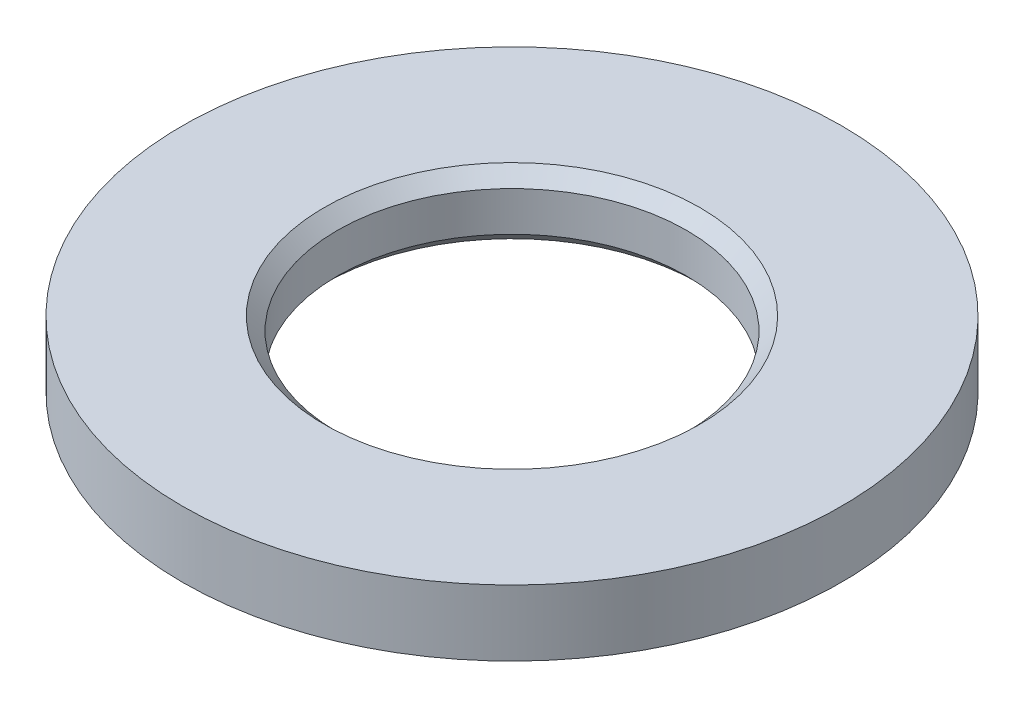
ISO-10303-21;
HEADER;
FILE_DESCRIPTION(('STEP AP214'),'2;1');
FILE_NAME('part.step','',(''),(''),'','','');
FILE_SCHEMA(('AUTOMOTIVE_DESIGN { 1 0 10303 214 1 1 1 1 }'));
ENDSEC;
DATA;
#1=APPLICATION_CONTEXT('core data for automotive mechanical design processes');
#2=APPLICATION_PROTOCOL_DEFINITION('international standard','automotive_design',2000,#1);
#3=PRODUCT_CONTEXT('',#1,'mechanical');
#4=PRODUCT('Part','Part','',(#3));
#5=PRODUCT_RELATED_PRODUCT_CATEGORY('part','',(#4));
#6=PRODUCT_DEFINITION_FORMATION('','',#4);
#7=PRODUCT_DEFINITION_CONTEXT('part definition',#1,'design');
#8=PRODUCT_DEFINITION('design','',#6,#7);
#9=PRODUCT_DEFINITION_SHAPE('','',#8);
#10=(LENGTH_UNIT() NAMED_UNIT(*) SI_UNIT(.MILLI.,.METRE.));
#11=(NAMED_UNIT(*) PLANE_ANGLE_UNIT() SI_UNIT($,.RADIAN.));
#12=(NAMED_UNIT(*) SI_UNIT($,.STERADIAN.) SOLID_ANGLE_UNIT());
#13=UNCERTAINTY_MEASURE_WITH_UNIT(LENGTH_MEASURE(1.E-05),#10,'distance_accuracy_value','');
#14=(GEOMETRIC_REPRESENTATION_CONTEXT(3) GLOBAL_UNCERTAINTY_ASSIGNED_CONTEXT((#13)) GLOBAL_UNIT_ASSIGNED_CONTEXT((#10,
#11,#12)) REPRESENTATION_CONTEXT('',''));
#15=CARTESIAN_POINT('',(0.,0.,0.));
#16=DIRECTION('',(0.,0.,1.));
#17=DIRECTION('',(1.,0.,0.));
#18=AXIS2_PLACEMENT_3D('',#15,#16,#17);
#19=CARTESIAN_POINT('',(0.,0.2,0.));
#20=DIRECTION('',(0.,-1.,0.));
#21=DIRECTION('',(0.,0.,-1.));
#22=AXIS2_PLACEMENT_3D('',#19,#20,#21);
#23=CONICAL_SURFACE('',#22,2.65,0.785398163397448);
#24=CARTESIAN_POINT('',(0.,0.,0.));
#25=DIRECTION('',(0.,-1.,0.));
#26=DIRECTION('',(0.,0.,-1.));
#27=AXIS2_PLACEMENT_3D('',#24,#25,#26);
#28=CIRCLE('',#27,2.85);
#29=CARTESIAN_POINT('',(0.,0.,-2.85));
#30=VERTEX_POINT('',#29);
#31=EDGE_CURVE('E8',#30,#30,#28,.T.);
#32=ORIENTED_EDGE('',*,*,#31,.T.);
#33=EDGE_LOOP('',(#32));
#34=FACE_BOUND('',#33,.T.);
#35=CARTESIAN_POINT('',(0.,0.2,0.));
#36=DIRECTION('',(0.,-1.,0.));
#37=DIRECTION('',(0.,0.,-1.));
#38=AXIS2_PLACEMENT_3D('',#35,#36,#37);
#39=CIRCLE('',#38,2.65);
#40=CARTESIAN_POINT('',(0.,0.2,-2.65));
#41=VERTEX_POINT('',#40);
#42=EDGE_CURVE('E47',#41,#41,#39,.T.);
#43=ORIENTED_EDGE('',*,*,#42,.F.);
#44=EDGE_LOOP('',(#43));
#45=FACE_BOUND('',#44,.T.);
#46=ADVANCED_FACE('F13',(#34,#45),#23,.F.);
#47=CARTESIAN_POINT('',(2.85,0.,0.));
#48=DIRECTION('',(0.,-1.,0.));
#49=DIRECTION('',(0.,0.,-1.));
#50=AXIS2_PLACEMENT_3D('',#47,#48,#49);
#51=PLANE('',#50);
#52=CARTESIAN_POINT('',(0.,0.,0.));
#53=DIRECTION('',(0.,-1.,0.));
#54=DIRECTION('',(0.,0.,-1.));
#55=AXIS2_PLACEMENT_3D('',#52,#53,#54);
#56=CIRCLE('',#55,5.);
#57=CARTESIAN_POINT('',(0.,0.,-5.));
#58=VERTEX_POINT('',#57);
#59=EDGE_CURVE('E20',#58,#58,#56,.T.);
#60=ORIENTED_EDGE('',*,*,#59,.T.);
#61=EDGE_LOOP('',(#60));
#62=FACE_BOUND('',#61,.T.);
#63=ORIENTED_EDGE('',*,*,#31,.F.);
#64=EDGE_LOOP('',(#63));
#65=FACE_BOUND('',#64,.T.);
#66=ADVANCED_FACE('F56',(#62,#65),#51,.T.);
#67=CARTESIAN_POINT('',(0.,0.,0.));
#68=DIRECTION('',(0.,-1.,0.));
#69=DIRECTION('',(0.,0.,-1.));
#70=AXIS2_PLACEMENT_3D('',#67,#68,#69);
#71=CYLINDRICAL_SURFACE('',#70,5.);
#72=CARTESIAN_POINT('',(0.,1.,0.));
#73=DIRECTION('',(0.,-1.,0.));
#74=DIRECTION('',(0.,0.,-1.));
#75=AXIS2_PLACEMENT_3D('',#72,#73,#74);
#76=CIRCLE('',#75,5.);
#77=CARTESIAN_POINT('',(0.,1.,-5.));
#78=VERTEX_POINT('',#77);
#79=EDGE_CURVE('E29',#78,#78,#76,.T.);
#80=ORIENTED_EDGE('',*,*,#79,.T.);
#81=EDGE_LOOP('',(#80));
#82=FACE_BOUND('',#81,.T.);
#83=ORIENTED_EDGE('',*,*,#59,.F.);
#84=EDGE_LOOP('',(#83));
#85=FACE_BOUND('',#84,.T.);
#86=ADVANCED_FACE('F61',(#82,#85),#71,.T.);
#87=CARTESIAN_POINT('',(5.,1.,0.));
#88=DIRECTION('',(0.,1.,0.));
#89=DIRECTION('',(0.,0.,1.));
#90=AXIS2_PLACEMENT_3D('',#87,#88,#89);
#91=PLANE('',#90);
#92=CARTESIAN_POINT('',(0.,1.,0.));
#93=DIRECTION('',(0.,-1.,0.));
#94=DIRECTION('',(0.,0.,-1.));
#95=AXIS2_PLACEMENT_3D('',#92,#93,#94);
#96=CIRCLE('',#95,2.85);
#97=CARTESIAN_POINT('',(0.,1.,-2.85));
#98=VERTEX_POINT('',#97);
#99=EDGE_CURVE('E37',#98,#98,#96,.T.);
#100=ORIENTED_EDGE('',*,*,#99,.T.);
#101=EDGE_LOOP('',(#100));
#102=FACE_BOUND('',#101,.T.);
#103=ORIENTED_EDGE('',*,*,#79,.F.);
#104=EDGE_LOOP('',(#103));
#105=FACE_BOUND('',#104,.T.);
#106=ADVANCED_FACE('F65',(#102,#105),#91,.T.);
#107=CARTESIAN_POINT('',(0.,1.,0.));
#108=DIRECTION('',(0.,1.,0.));
#109=DIRECTION('',(0.,0.,1.));
#110=AXIS2_PLACEMENT_3D('',#107,#108,#109);
#111=CONICAL_SURFACE('',#110,2.85,0.785398163397448);
#112=CARTESIAN_POINT('',(0.,0.8,0.));
#113=DIRECTION('',(0.,-1.,0.));
#114=DIRECTION('',(0.,0.,-1.));
#115=AXIS2_PLACEMENT_3D('',#112,#113,#114);
#116=CIRCLE('',#115,2.65);
#117=CARTESIAN_POINT('',(0.,0.8,-2.65));
#118=VERTEX_POINT('',#117);
#119=EDGE_CURVE('E43',#118,#118,#116,.T.);
#120=ORIENTED_EDGE('',*,*,#119,.T.);
#121=EDGE_LOOP('',(#120));
#122=FACE_BOUND('',#121,.T.);
#123=ORIENTED_EDGE('',*,*,#99,.F.);
#124=EDGE_LOOP('',(#123));
#125=FACE_BOUND('',#124,.T.);
#126=ADVANCED_FACE('F72',(#122,#125),#111,.F.);
#127=CARTESIAN_POINT('',(0.,0.,0.));
#128=DIRECTION('',(0.,-1.,0.));
#129=DIRECTION('',(0.,0.,-1.));
#130=AXIS2_PLACEMENT_3D('',#127,#128,#129);
#131=CYLINDRICAL_SURFACE('',#130,2.65);
#132=ORIENTED_EDGE('',*,*,#42,.T.);
#133=EDGE_LOOP('',(#132));
#134=FACE_BOUND('',#133,.T.);
#135=ORIENTED_EDGE('',*,*,#119,.F.);
#136=EDGE_LOOP('',(#135));
#137=FACE_BOUND('',#136,.T.);
#138=ADVANCED_FACE('F52',(#134,#137),#131,.F.);
#139=CLOSED_SHELL('',(#46,#66,#86,#106,#126,#138));
#140=MANIFOLD_SOLID_BREP('B1',#139);
#141=ADVANCED_BREP_SHAPE_REPRESENTATION('',(#18,#140),#14);
#142=SHAPE_DEFINITION_REPRESENTATION(#9,#141);
ENDSEC;
END-ISO-10303-21;
